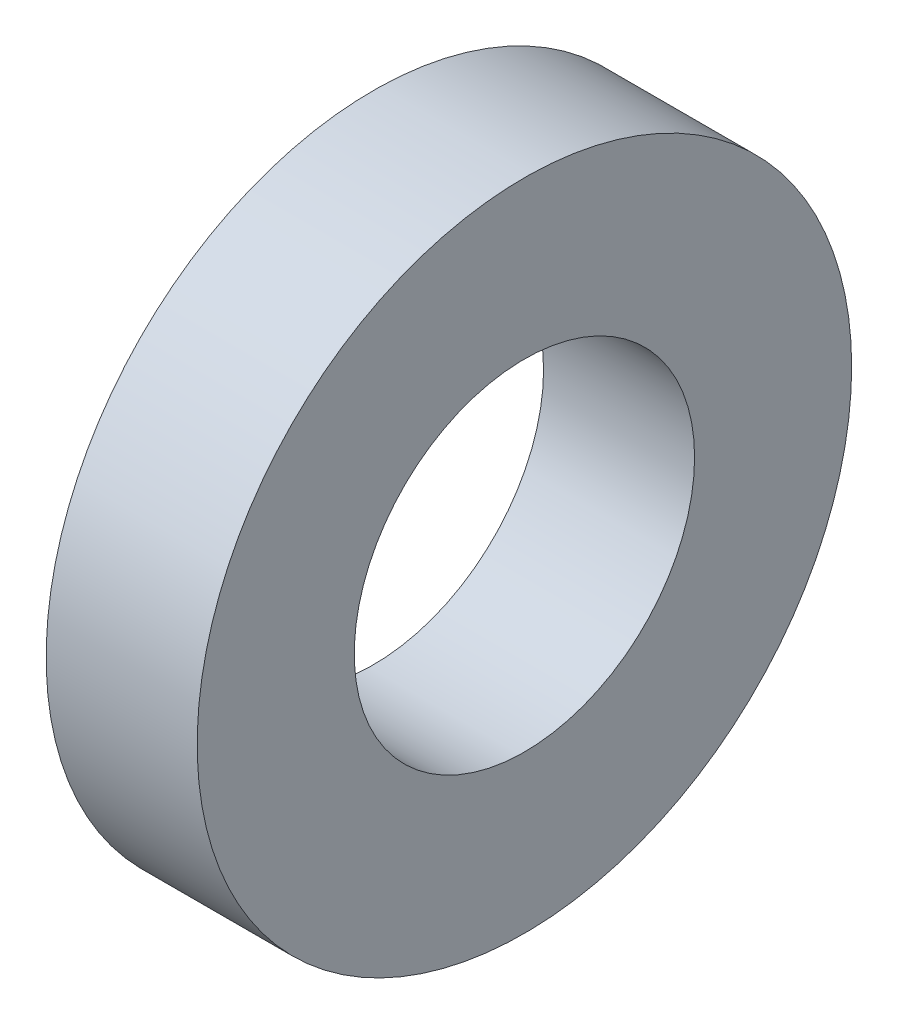
ISO-10303-21;
HEADER;
FILE_DESCRIPTION(('STEP AP214'),'2;1');
FILE_NAME('part.step','',(''),(''),'','','');
FILE_SCHEMA(('AUTOMOTIVE_DESIGN { 1 0 10303 214 1 1 1 1 }'));
ENDSEC;
DATA;
#1=APPLICATION_CONTEXT('core data for automotive mechanical design processes');
#2=APPLICATION_PROTOCOL_DEFINITION('international standard','automotive_design',2000,#1);
#3=PRODUCT_CONTEXT('',#1,'mechanical');
#4=PRODUCT('Part','Part','',(#3));
#5=PRODUCT_RELATED_PRODUCT_CATEGORY('part','',(#4));
#6=PRODUCT_DEFINITION_FORMATION('','',#4);
#7=PRODUCT_DEFINITION_CONTEXT('part definition',#1,'design');
#8=PRODUCT_DEFINITION('design','',#6,#7);
#9=PRODUCT_DEFINITION_SHAPE('','',#8);
#10=(LENGTH_UNIT() NAMED_UNIT(*) SI_UNIT(.MILLI.,.METRE.));
#11=(NAMED_UNIT(*) PLANE_ANGLE_UNIT() SI_UNIT($,.RADIAN.));
#12=(NAMED_UNIT(*) SI_UNIT($,.STERADIAN.) SOLID_ANGLE_UNIT());
#13=UNCERTAINTY_MEASURE_WITH_UNIT(LENGTH_MEASURE(1.E-05),#10,'distance_accuracy_value','');
#14=(GEOMETRIC_REPRESENTATION_CONTEXT(3) GLOBAL_UNCERTAINTY_ASSIGNED_CONTEXT((#13)) GLOBAL_UNIT_ASSIGNED_CONTEXT((#10,
#11,#12)) REPRESENTATION_CONTEXT('',''));
#15=CARTESIAN_POINT('',(0.,0.,0.));
#16=DIRECTION('',(0.,0.,1.));
#17=DIRECTION('',(1.,0.,0.));
#18=AXIS2_PLACEMENT_3D('',#15,#16,#17);
#19=CARTESIAN_POINT('',(15.,0.,0.));
#20=DIRECTION('',(1.,0.,0.));
#21=DIRECTION('',(0.,0.,-1.));
#22=AXIS2_PLACEMENT_3D('',#19,#20,#21);
#23=PLANE('',#22);
#24=CARTESIAN_POINT('',(15.,0.,0.));
#25=DIRECTION('',(1.,0.,0.));
#26=DIRECTION('',(0.,0.,-1.));
#27=AXIS2_PLACEMENT_3D('',#24,#25,#26);
#28=CIRCLE('',#27,32.5);
#29=CARTESIAN_POINT('',(15.,0.,-32.5));
#30=VERTEX_POINT('',#29);
#31=EDGE_CURVE('E10',#30,#30,#28,.T.);
#32=ORIENTED_EDGE('',*,*,#31,.T.);
#33=EDGE_LOOP('',(#32));
#34=FACE_BOUND('',#33,.T.);
#35=CARTESIAN_POINT('',(15.,0.,0.));
#36=DIRECTION('',(1.,0.,0.));
#37=DIRECTION('',(0.,0.,-1.));
#38=AXIS2_PLACEMENT_3D('',#35,#36,#37);
#39=CIRCLE('',#38,16.9);
#40=CARTESIAN_POINT('',(15.,0.,-16.9));
#41=VERTEX_POINT('',#40);
#42=EDGE_CURVE('E46',#41,#41,#39,.T.);
#43=ORIENTED_EDGE('',*,*,#42,.F.);
#44=EDGE_LOOP('',(#43));
#45=FACE_BOUND('',#44,.T.);
#46=ADVANCED_FACE('F35',(#34,#45),#23,.T.);
#47=CARTESIAN_POINT('',(0.,0.,0.));
#48=DIRECTION('',(1.,0.,0.));
#49=DIRECTION('',(0.,0.,-1.));
#50=AXIS2_PLACEMENT_3D('',#47,#48,#49);
#51=PLANE('',#50);
#52=CARTESIAN_POINT('',(0.,0.,0.));
#53=DIRECTION('',(1.,0.,0.));
#54=DIRECTION('',(0.,0.,-1.));
#55=AXIS2_PLACEMENT_3D('',#52,#53,#54);
#56=CIRCLE('',#55,32.5);
#57=CARTESIAN_POINT('',(0.,0.,-32.5));
#58=VERTEX_POINT('',#57);
#59=EDGE_CURVE('E39',#58,#58,#56,.T.);
#60=ORIENTED_EDGE('',*,*,#59,.F.);
#61=EDGE_LOOP('',(#60));
#62=FACE_BOUND('',#61,.T.);
#63=CARTESIAN_POINT('',(0.,0.,0.));
#64=DIRECTION('',(1.,0.,0.));
#65=DIRECTION('',(0.,0.,-1.));
#66=AXIS2_PLACEMENT_3D('',#63,#64,#65);
#67=CIRCLE('',#66,16.9);
#68=CARTESIAN_POINT('',(0.,0.,-16.9));
#69=VERTEX_POINT('',#68);
#70=EDGE_CURVE('E48',#69,#69,#67,.T.);
#71=ORIENTED_EDGE('',*,*,#70,.T.);
#72=EDGE_LOOP('',(#71));
#73=FACE_BOUND('',#72,.T.);
#74=ADVANCED_FACE('F58',(#62,#73),#51,.F.);
#75=CARTESIAN_POINT('',(15.,0.,0.));
#76=DIRECTION('',(-1.,0.,0.));
#77=DIRECTION('',(0.,0.,1.));
#78=AXIS2_PLACEMENT_3D('',#75,#76,#77);
#79=CYLINDRICAL_SURFACE('',#78,32.5);
#80=ORIENTED_EDGE('',*,*,#31,.F.);
#81=EDGE_LOOP('',(#80));
#82=FACE_BOUND('',#81,.T.);
#83=ORIENTED_EDGE('',*,*,#59,.T.);
#84=EDGE_LOOP('',(#83));
#85=FACE_BOUND('',#84,.T.);
#86=ADVANCED_FACE('F37',(#82,#85),#79,.T.);
#87=CARTESIAN_POINT('',(15.,0.,0.));
#88=DIRECTION('',(-1.,0.,0.));
#89=DIRECTION('',(0.,0.,1.));
#90=AXIS2_PLACEMENT_3D('',#87,#88,#89);
#91=CYLINDRICAL_SURFACE('',#90,16.9);
#92=ORIENTED_EDGE('',*,*,#42,.T.);
#93=EDGE_LOOP('',(#92));
#94=FACE_BOUND('',#93,.T.);
#95=ORIENTED_EDGE('',*,*,#70,.F.);
#96=EDGE_LOOP('',(#95));
#97=FACE_BOUND('',#96,.T.);
#98=ADVANCED_FACE('F54',(#94,#97),#91,.F.);
#99=CLOSED_SHELL('',(#46,#74,#86,#98));
#100=MANIFOLD_SOLID_BREP('B2',#99);
#101=ADVANCED_BREP_SHAPE_REPRESENTATION('',(#18,#100),#14);
#102=SHAPE_DEFINITION_REPRESENTATION(#9,#101);
ENDSEC;
END-ISO-10303-21;
